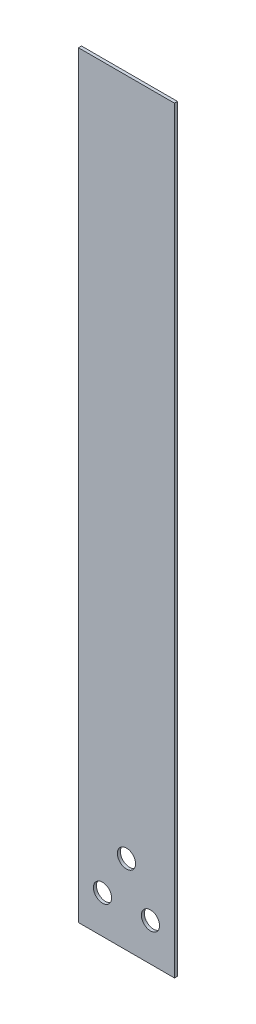
ISO-10303-21;
HEADER;
FILE_DESCRIPTION(('STEP AP214'),'2;1');
FILE_NAME('part.step','',(''),(''),'','','');
FILE_SCHEMA(('AUTOMOTIVE_DESIGN { 1 0 10303 214 1 1 1 1 }'));
ENDSEC;
DATA;
#1=APPLICATION_CONTEXT('core data for automotive mechanical design processes');
#2=APPLICATION_PROTOCOL_DEFINITION('international standard','automotive_design',2000,#1);
#3=PRODUCT_CONTEXT('',#1,'mechanical');
#4=PRODUCT('Part','Part','',(#3));
#5=PRODUCT_RELATED_PRODUCT_CATEGORY('part','',(#4));
#6=PRODUCT_DEFINITION_FORMATION('','',#4);
#7=PRODUCT_DEFINITION_CONTEXT('part definition',#1,'design');
#8=PRODUCT_DEFINITION('design','',#6,#7);
#9=PRODUCT_DEFINITION_SHAPE('','',#8);
#10=(LENGTH_UNIT() NAMED_UNIT(*) SI_UNIT(.MILLI.,.METRE.));
#11=(NAMED_UNIT(*) PLANE_ANGLE_UNIT() SI_UNIT($,.RADIAN.));
#12=(NAMED_UNIT(*) SI_UNIT($,.STERADIAN.) SOLID_ANGLE_UNIT());
#13=UNCERTAINTY_MEASURE_WITH_UNIT(LENGTH_MEASURE(1.E-05),#10,'distance_accuracy_value','');
#14=(GEOMETRIC_REPRESENTATION_CONTEXT(3) GLOBAL_UNCERTAINTY_ASSIGNED_CONTEXT((#13)) GLOBAL_UNIT_ASSIGNED_CONTEXT((#10,
#11,#12)) REPRESENTATION_CONTEXT('',''));
#15=CARTESIAN_POINT('',(0.,0.,0.));
#16=DIRECTION('',(0.,0.,1.));
#17=DIRECTION('',(1.,0.,0.));
#18=AXIS2_PLACEMENT_3D('',#15,#16,#17);
#19=CARTESIAN_POINT('',(19.,150.,1.2));
#20=DIRECTION('',(-1.,0.,0.));
#21=DIRECTION('',(0.,-1.,0.));
#22=AXIS2_PLACEMENT_3D('',#19,#20,#21);
#23=PLANE('',#22);
#24=DIRECTION('',(0.,1.,0.));
#25=VECTOR('',#24,1.);
#26=CARTESIAN_POINT('',(19.,150.,0.));
#27=LINE('',#26,#25);
#28=CARTESIAN_POINT('',(19.,-150.,0.));
#29=VERTEX_POINT('',#28);
#30=CARTESIAN_POINT('',(19.,150.,0.));
#31=VERTEX_POINT('',#30);
#32=EDGE_CURVE('E105',#29,#31,#27,.T.);
#33=ORIENTED_EDGE('',*,*,#32,.T.);
#34=DIRECTION('',(0.,0.,-1.));
#35=VECTOR('',#34,1.);
#36=CARTESIAN_POINT('',(19.,150.,1.2));
#37=LINE('',#36,#35);
#38=CARTESIAN_POINT('',(19.,150.,1.2));
#39=VERTEX_POINT('',#38);
#40=EDGE_CURVE('E12',#39,#31,#37,.T.);
#41=ORIENTED_EDGE('',*,*,#40,.F.);
#42=DIRECTION('',(0.,1.,0.));
#43=VECTOR('',#42,1.);
#44=CARTESIAN_POINT('',(19.,150.,1.2));
#45=LINE('',#44,#43);
#46=CARTESIAN_POINT('',(19.,-150.,1.2));
#47=VERTEX_POINT('',#46);
#48=EDGE_CURVE('E93',#47,#39,#45,.T.);
#49=ORIENTED_EDGE('',*,*,#48,.F.);
#50=DIRECTION('',(0.,0.,-1.));
#51=VECTOR('',#50,1.);
#52=CARTESIAN_POINT('',(19.,-150.,1.2));
#53=LINE('',#52,#51);
#54=EDGE_CURVE('E101',#47,#29,#53,.T.);
#55=ORIENTED_EDGE('',*,*,#54,.T.);
#56=EDGE_LOOP('',(#33,#41,#49,#55));
#57=FACE_BOUND('',#56,.T.);
#58=ADVANCED_FACE('F42',(#57),#23,.F.);
#59=CARTESIAN_POINT('',(-19.,150.,1.2));
#60=DIRECTION('',(0.,-1.,0.));
#61=DIRECTION('',(0.,0.,-1.));
#62=AXIS2_PLACEMENT_3D('',#59,#60,#61);
#63=PLANE('',#62);
#64=DIRECTION('',(-1.,0.,0.));
#65=VECTOR('',#64,1.);
#66=CARTESIAN_POINT('',(-19.,150.,0.));
#67=LINE('',#66,#65);
#68=CARTESIAN_POINT('',(-19.,150.,0.));
#69=VERTEX_POINT('',#68);
#70=EDGE_CURVE('E97',#31,#69,#67,.T.);
#71=ORIENTED_EDGE('',*,*,#70,.T.);
#72=DIRECTION('',(0.,0.,-1.));
#73=VECTOR('',#72,1.);
#74=CARTESIAN_POINT('',(-19.,150.,1.2));
#75=LINE('',#74,#73);
#76=CARTESIAN_POINT('',(-19.,150.,1.2));
#77=VERTEX_POINT('',#76);
#78=EDGE_CURVE('E50',#77,#69,#75,.T.);
#79=ORIENTED_EDGE('',*,*,#78,.F.);
#80=DIRECTION('',(-1.,0.,0.));
#81=VECTOR('',#80,1.);
#82=CARTESIAN_POINT('',(-19.,150.,1.2));
#83=LINE('',#82,#81);
#84=EDGE_CURVE('E88',#39,#77,#83,.T.);
#85=ORIENTED_EDGE('',*,*,#84,.F.);
#86=ORIENTED_EDGE('',*,*,#40,.T.);
#87=EDGE_LOOP('',(#71,#79,#85,#86));
#88=FACE_BOUND('',#87,.T.);
#89=ADVANCED_FACE('F96',(#88),#63,.F.);
#90=CARTESIAN_POINT('',(-19.,150.,1.2));
#91=DIRECTION('',(1.,0.,0.));
#92=DIRECTION('',(0.,1.,0.));
#93=AXIS2_PLACEMENT_3D('',#90,#91,#92);
#94=PLANE('',#93);
#95=DIRECTION('',(0.,-1.,0.));
#96=VECTOR('',#95,1.);
#97=CARTESIAN_POINT('',(-19.,150.,0.));
#98=LINE('',#97,#96);
#99=CARTESIAN_POINT('',(-19.,-150.,0.));
#100=VERTEX_POINT('',#99);
#101=EDGE_CURVE('E75',#69,#100,#98,.T.);
#102=ORIENTED_EDGE('',*,*,#101,.T.);
#103=DIRECTION('',(0.,0.,-1.));
#104=VECTOR('',#103,1.);
#105=CARTESIAN_POINT('',(-19.,-150.,1.2));
#106=LINE('',#105,#104);
#107=CARTESIAN_POINT('',(-19.,-150.,1.2));
#108=VERTEX_POINT('',#107);
#109=EDGE_CURVE('E98',#108,#100,#106,.T.);
#110=ORIENTED_EDGE('',*,*,#109,.F.);
#111=DIRECTION('',(0.,-1.,0.));
#112=VECTOR('',#111,1.);
#113=CARTESIAN_POINT('',(-19.,150.,1.2));
#114=LINE('',#113,#112);
#115=EDGE_CURVE('E91',#77,#108,#114,.T.);
#116=ORIENTED_EDGE('',*,*,#115,.F.);
#117=ORIENTED_EDGE('',*,*,#78,.T.);
#118=EDGE_LOOP('',(#102,#110,#116,#117));
#119=FACE_BOUND('',#118,.T.);
#120=ADVANCED_FACE('F99',(#119),#94,.F.);
#121=CARTESIAN_POINT('',(-19.,-150.,1.2));
#122=DIRECTION('',(0.,1.,0.));
#123=DIRECTION('',(0.,0.,1.));
#124=AXIS2_PLACEMENT_3D('',#121,#122,#123);
#125=PLANE('',#124);
#126=DIRECTION('',(1.,0.,0.));
#127=VECTOR('',#126,1.);
#128=CARTESIAN_POINT('',(-19.,-150.,0.));
#129=LINE('',#128,#127);
#130=EDGE_CURVE('E81',#100,#29,#129,.T.);
#131=ORIENTED_EDGE('',*,*,#130,.T.);
#132=ORIENTED_EDGE('',*,*,#54,.F.);
#133=DIRECTION('',(1.,0.,0.));
#134=VECTOR('',#133,1.);
#135=CARTESIAN_POINT('',(-19.,-150.,1.2));
#136=LINE('',#135,#134);
#137=EDGE_CURVE('E58',#108,#47,#136,.T.);
#138=ORIENTED_EDGE('',*,*,#137,.F.);
#139=ORIENTED_EDGE('',*,*,#109,.T.);
#140=EDGE_LOOP('',(#131,#132,#138,#139));
#141=FACE_BOUND('',#140,.T.);
#142=ADVANCED_FACE('F113',(#141),#125,.F.);
#143=CARTESIAN_POINT('',(0.,0.,1.2));
#144=DIRECTION('',(0.,0.,1.));
#145=DIRECTION('',(1.,0.,0.));
#146=AXIS2_PLACEMENT_3D('',#143,#144,#145);
#147=PLANE('',#146);
#148=CARTESIAN_POINT('',(0.,-118.545517328096,1.2));
#149=DIRECTION('',(0.,0.,1.));
#150=DIRECTION('',(1.,0.,0.));
#151=AXIS2_PLACEMENT_3D('',#148,#149,#150);
#152=CIRCLE('',#151,3.6);
#153=CARTESIAN_POINT('',(3.6,-118.545517328096,1.2));
#154=VERTEX_POINT('',#153);
#155=EDGE_CURVE('E131',#154,#154,#152,.T.);
#156=ORIENTED_EDGE('',*,*,#155,.F.);
#157=EDGE_LOOP('',(#156));
#158=FACE_BOUND('',#157,.T.);
#159=CARTESIAN_POINT('',(-9.50000000000002,-135.,1.2));
#160=DIRECTION('',(0.,0.,1.));
#161=DIRECTION('',(1.,0.,0.));
#162=AXIS2_PLACEMENT_3D('',#159,#160,#161);
#163=CIRCLE('',#162,3.6);
#164=CARTESIAN_POINT('',(-5.90000000000002,-135.,1.2));
#165=VERTEX_POINT('',#164);
#166=EDGE_CURVE('E128',#165,#165,#163,.T.);
#167=ORIENTED_EDGE('',*,*,#166,.F.);
#168=EDGE_LOOP('',(#167));
#169=FACE_BOUND('',#168,.T.);
#170=CARTESIAN_POINT('',(9.50000000000002,-135.,1.2));
#171=DIRECTION('',(0.,0.,1.));
#172=DIRECTION('',(1.,0.,0.));
#173=AXIS2_PLACEMENT_3D('',#170,#171,#172);
#174=CIRCLE('',#173,3.6);
#175=CARTESIAN_POINT('',(13.1,-135.,1.2));
#176=VERTEX_POINT('',#175);
#177=EDGE_CURVE('E122',#176,#176,#174,.T.);
#178=ORIENTED_EDGE('',*,*,#177,.F.);
#179=EDGE_LOOP('',(#178));
#180=FACE_BOUND('',#179,.T.);
#181=ORIENTED_EDGE('',*,*,#48,.T.);
#182=ORIENTED_EDGE('',*,*,#84,.T.);
#183=ORIENTED_EDGE('',*,*,#115,.T.);
#184=ORIENTED_EDGE('',*,*,#137,.T.);
#185=EDGE_LOOP('',(#181,#182,#183,#184));
#186=FACE_BOUND('',#185,.T.);
#187=ADVANCED_FACE('F89',(#158,#169,#180,#186),#147,.T.);
#188=CARTESIAN_POINT('',(0.,0.,0.));
#189=DIRECTION('',(0.,0.,1.));
#190=DIRECTION('',(1.,0.,0.));
#191=AXIS2_PLACEMENT_3D('',#188,#189,#190);
#192=PLANE('',#191);
#193=CARTESIAN_POINT('',(0.,-118.545517328096,0.));
#194=DIRECTION('',(0.,0.,1.));
#195=DIRECTION('',(1.,0.,0.));
#196=AXIS2_PLACEMENT_3D('',#193,#194,#195);
#197=CIRCLE('',#196,3.6);
#198=CARTESIAN_POINT('',(3.6,-118.545517328096,0.));
#199=VERTEX_POINT('',#198);
#200=EDGE_CURVE('E108',#199,#199,#197,.T.);
#201=ORIENTED_EDGE('',*,*,#200,.T.);
#202=EDGE_LOOP('',(#201));
#203=FACE_BOUND('',#202,.T.);
#204=CARTESIAN_POINT('',(-9.50000000000002,-135.,0.));
#205=DIRECTION('',(0.,0.,1.));
#206=DIRECTION('',(1.,0.,0.));
#207=AXIS2_PLACEMENT_3D('',#204,#205,#206);
#208=CIRCLE('',#207,3.6);
#209=CARTESIAN_POINT('',(-5.90000000000002,-135.,0.));
#210=VERTEX_POINT('',#209);
#211=EDGE_CURVE('E125',#210,#210,#208,.T.);
#212=ORIENTED_EDGE('',*,*,#211,.T.);
#213=EDGE_LOOP('',(#212));
#214=FACE_BOUND('',#213,.T.);
#215=CARTESIAN_POINT('',(9.50000000000002,-135.,0.));
#216=DIRECTION('',(0.,0.,1.));
#217=DIRECTION('',(1.,0.,0.));
#218=AXIS2_PLACEMENT_3D('',#215,#216,#217);
#219=CIRCLE('',#218,3.6);
#220=CARTESIAN_POINT('',(13.1,-135.,0.));
#221=VERTEX_POINT('',#220);
#222=EDGE_CURVE('E119',#221,#221,#219,.T.);
#223=ORIENTED_EDGE('',*,*,#222,.T.);
#224=EDGE_LOOP('',(#223));
#225=FACE_BOUND('',#224,.T.);
#226=ORIENTED_EDGE('',*,*,#32,.F.);
#227=ORIENTED_EDGE('',*,*,#130,.F.);
#228=ORIENTED_EDGE('',*,*,#101,.F.);
#229=ORIENTED_EDGE('',*,*,#70,.F.);
#230=EDGE_LOOP('',(#226,#227,#228,#229));
#231=FACE_BOUND('',#230,.T.);
#232=ADVANCED_FACE('F116',(#203,#214,#225,#231),#192,.F.);
#233=CARTESIAN_POINT('',(9.50000000000002,-135.,0.));
#234=DIRECTION('',(0.,0.,1.));
#235=DIRECTION('',(1.,0.,0.));
#236=AXIS2_PLACEMENT_3D('',#233,#234,#235);
#237=CYLINDRICAL_SURFACE('',#236,3.6);
#238=ORIENTED_EDGE('',*,*,#177,.T.);
#239=EDGE_LOOP('',(#238));
#240=FACE_BOUND('',#239,.T.);
#241=ORIENTED_EDGE('',*,*,#222,.F.);
#242=EDGE_LOOP('',(#241));
#243=FACE_BOUND('',#242,.T.);
#244=ADVANCED_FACE('F153',(#240,#243),#237,.F.);
#245=CARTESIAN_POINT('',(-9.50000000000002,-135.,0.));
#246=DIRECTION('',(0.,0.,1.));
#247=DIRECTION('',(1.,0.,0.));
#248=AXIS2_PLACEMENT_3D('',#245,#246,#247);
#249=CYLINDRICAL_SURFACE('',#248,3.6);
#250=ORIENTED_EDGE('',*,*,#211,.F.);
#251=EDGE_LOOP('',(#250));
#252=FACE_BOUND('',#251,.T.);
#253=ORIENTED_EDGE('',*,*,#166,.T.);
#254=EDGE_LOOP('',(#253));
#255=FACE_BOUND('',#254,.T.);
#256=ADVANCED_FACE('F142',(#252,#255),#249,.F.);
#257=CARTESIAN_POINT('',(0.,-118.545517328096,0.));
#258=DIRECTION('',(0.,0.,1.));
#259=DIRECTION('',(1.,0.,0.));
#260=AXIS2_PLACEMENT_3D('',#257,#258,#259);
#261=CYLINDRICAL_SURFACE('',#260,3.6);
#262=ORIENTED_EDGE('',*,*,#200,.F.);
#263=EDGE_LOOP('',(#262));
#264=FACE_BOUND('',#263,.T.);
#265=ORIENTED_EDGE('',*,*,#155,.T.);
#266=EDGE_LOOP('',(#265));
#267=FACE_BOUND('',#266,.T.);
#268=ADVANCED_FACE('F139',(#264,#267),#261,.F.);
#269=CLOSED_SHELL('',(#58,#89,#120,#142,#187,#232,#244,#256,#268));
#270=MANIFOLD_SOLID_BREP('B2',#269);
#271=ADVANCED_BREP_SHAPE_REPRESENTATION('',(#18,#270),#14);
#272=SHAPE_DEFINITION_REPRESENTATION(#9,#271);
ENDSEC;
END-ISO-10303-21;
